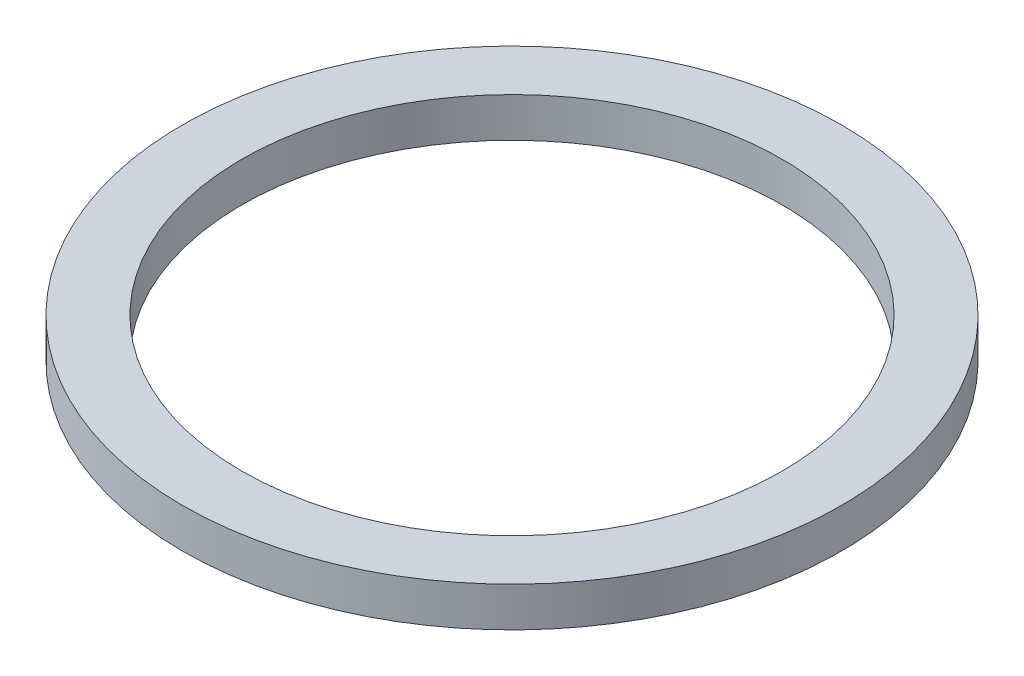
ISO-10303-21;
HEADER;
FILE_DESCRIPTION(('STEP AP214'),'2;1');
FILE_NAME('part.step','',(''),(''),'','','');
FILE_SCHEMA(('AUTOMOTIVE_DESIGN { 1 0 10303 214 1 1 1 1 }'));
ENDSEC;
DATA;
#1=APPLICATION_CONTEXT('core data for automotive mechanical design processes');
#2=APPLICATION_PROTOCOL_DEFINITION('international standard','automotive_design',2000,#1);
#3=PRODUCT_CONTEXT('',#1,'mechanical');
#4=PRODUCT('Part','Part','',(#3));
#5=PRODUCT_RELATED_PRODUCT_CATEGORY('part','',(#4));
#6=PRODUCT_DEFINITION_FORMATION('','',#4);
#7=PRODUCT_DEFINITION_CONTEXT('part definition',#1,'design');
#8=PRODUCT_DEFINITION('design','',#6,#7);
#9=PRODUCT_DEFINITION_SHAPE('','',#8);
#10=(LENGTH_UNIT() NAMED_UNIT(*) SI_UNIT(.MILLI.,.METRE.));
#11=(NAMED_UNIT(*) PLANE_ANGLE_UNIT() SI_UNIT($,.RADIAN.));
#12=(NAMED_UNIT(*) SI_UNIT($,.STERADIAN.) SOLID_ANGLE_UNIT());
#13=UNCERTAINTY_MEASURE_WITH_UNIT(LENGTH_MEASURE(1.E-05),#10,'distance_accuracy_value','');
#14=(GEOMETRIC_REPRESENTATION_CONTEXT(3) GLOBAL_UNCERTAINTY_ASSIGNED_CONTEXT((#13)) GLOBAL_UNIT_ASSIGNED_CONTEXT((#10,
#11,#12)) REPRESENTATION_CONTEXT('',''));
#15=CARTESIAN_POINT('',(0.,0.,0.));
#16=DIRECTION('',(0.,0.,1.));
#17=DIRECTION('',(1.,0.,0.));
#18=AXIS2_PLACEMENT_3D('',#15,#16,#17);
#19=CARTESIAN_POINT('',(0.,1.,0.));
#20=DIRECTION('',(0.,-1.,0.));
#21=DIRECTION('',(0.,0.,-1.));
#22=AXIS2_PLACEMENT_3D('',#19,#20,#21);
#23=CYLINDRICAL_SURFACE('',#22,8.325);
#24=CARTESIAN_POINT('',(0.,1.,0.));
#25=DIRECTION('',(0.,1.,0.));
#26=DIRECTION('',(0.,0.,1.));
#27=AXIS2_PLACEMENT_3D('',#24,#25,#26);
#28=CIRCLE('',#27,8.325);
#29=CARTESIAN_POINT('',(0.,1.,8.325));
#30=VERTEX_POINT('',#29);
#31=EDGE_CURVE('E11',#30,#30,#28,.T.);
#32=ORIENTED_EDGE('',*,*,#31,.F.);
#33=EDGE_LOOP('',(#32));
#34=FACE_BOUND('',#33,.T.);
#35=CARTESIAN_POINT('',(0.,0.,0.));
#36=DIRECTION('',(0.,1.,0.));
#37=DIRECTION('',(0.,0.,1.));
#38=AXIS2_PLACEMENT_3D('',#35,#36,#37);
#39=CIRCLE('',#38,8.325);
#40=CARTESIAN_POINT('',(0.,0.,8.325));
#41=VERTEX_POINT('',#40);
#42=EDGE_CURVE('E41',#41,#41,#39,.T.);
#43=ORIENTED_EDGE('',*,*,#42,.T.);
#44=EDGE_LOOP('',(#43));
#45=FACE_BOUND('',#44,.T.);
#46=ADVANCED_FACE('F38',(#34,#45),#23,.T.);
#47=CARTESIAN_POINT('',(0.,1.,0.));
#48=DIRECTION('',(0.,1.,0.));
#49=DIRECTION('',(0.,0.,1.));
#50=AXIS2_PLACEMENT_3D('',#47,#48,#49);
#51=PLANE('',#50);
#52=CARTESIAN_POINT('',(0.,1.,0.));
#53=DIRECTION('',(0.,1.,0.));
#54=DIRECTION('',(0.,0.,1.));
#55=AXIS2_PLACEMENT_3D('',#52,#53,#54);
#56=CIRCLE('',#55,6.825);
#57=CARTESIAN_POINT('',(0.,1.,6.825));
#58=VERTEX_POINT('',#57);
#59=EDGE_CURVE('E52',#58,#58,#56,.T.);
#60=ORIENTED_EDGE('',*,*,#59,.F.);
#61=EDGE_LOOP('',(#60));
#62=FACE_BOUND('',#61,.T.);
#63=ORIENTED_EDGE('',*,*,#31,.T.);
#64=EDGE_LOOP('',(#63));
#65=FACE_BOUND('',#64,.T.);
#66=ADVANCED_FACE('F68',(#62,#65),#51,.T.);
#67=CARTESIAN_POINT('',(0.,0.,0.));
#68=DIRECTION('',(0.,1.,0.));
#69=DIRECTION('',(0.,0.,1.));
#70=AXIS2_PLACEMENT_3D('',#67,#68,#69);
#71=PLANE('',#70);
#72=CARTESIAN_POINT('',(0.,0.,0.));
#73=DIRECTION('',(0.,1.,0.));
#74=DIRECTION('',(0.,0.,1.));
#75=AXIS2_PLACEMENT_3D('',#72,#73,#74);
#76=CIRCLE('',#75,6.825);
#77=CARTESIAN_POINT('',(0.,0.,6.825));
#78=VERTEX_POINT('',#77);
#79=EDGE_CURVE('E49',#78,#78,#76,.T.);
#80=ORIENTED_EDGE('',*,*,#79,.T.);
#81=EDGE_LOOP('',(#80));
#82=FACE_BOUND('',#81,.T.);
#83=ORIENTED_EDGE('',*,*,#42,.F.);
#84=EDGE_LOOP('',(#83));
#85=FACE_BOUND('',#84,.T.);
#86=ADVANCED_FACE('F59',(#82,#85),#71,.F.);
#87=CARTESIAN_POINT('',(0.,0.,0.));
#88=DIRECTION('',(0.,1.,0.));
#89=DIRECTION('',(0.,0.,1.));
#90=AXIS2_PLACEMENT_3D('',#87,#88,#89);
#91=CYLINDRICAL_SURFACE('',#90,6.825);
#92=ORIENTED_EDGE('',*,*,#79,.F.);
#93=EDGE_LOOP('',(#92));
#94=FACE_BOUND('',#93,.T.);
#95=ORIENTED_EDGE('',*,*,#59,.T.);
#96=EDGE_LOOP('',(#95));
#97=FACE_BOUND('',#96,.T.);
#98=ADVANCED_FACE('F62',(#94,#97),#91,.F.);
#99=CLOSED_SHELL('',(#46,#66,#86,#98));
#100=MANIFOLD_SOLID_BREP('B2',#99);
#101=ADVANCED_BREP_SHAPE_REPRESENTATION('',(#18,#100),#14);
#102=SHAPE_DEFINITION_REPRESENTATION(#9,#101);
ENDSEC;
END-ISO-10303-21;
